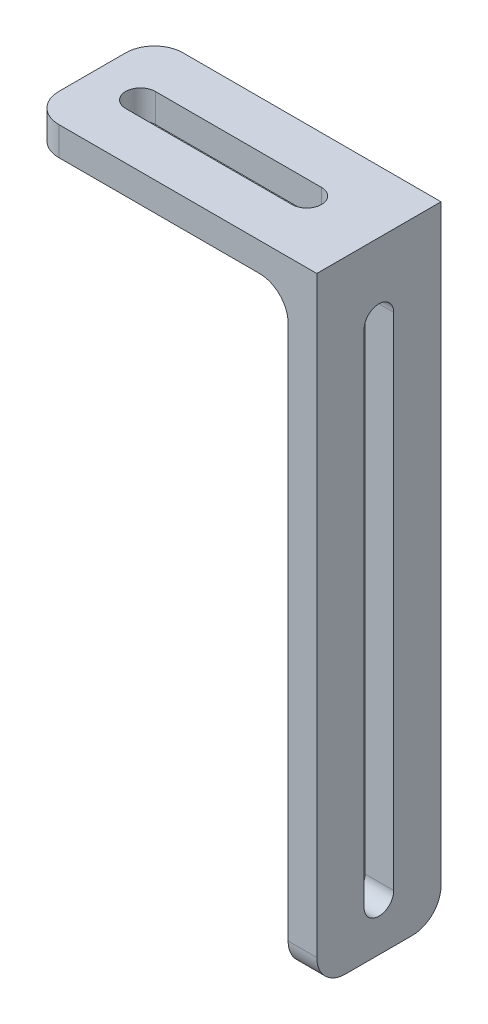
ISO-10303-21;
HEADER;
FILE_DESCRIPTION(('STEP AP214'),'2;1');
FILE_NAME('part.step','',(''),(''),'','','');
FILE_SCHEMA(('AUTOMOTIVE_DESIGN { 1 0 10303 214 1 1 1 1 }'));
ENDSEC;
DATA;
#1=APPLICATION_CONTEXT('core data for automotive mechanical design processes');
#2=APPLICATION_PROTOCOL_DEFINITION('international standard','automotive_design',2000,#1);
#3=PRODUCT_CONTEXT('',#1,'mechanical');
#4=PRODUCT('Part','Part','',(#3));
#5=PRODUCT_RELATED_PRODUCT_CATEGORY('part','',(#4));
#6=PRODUCT_DEFINITION_FORMATION('','',#4);
#7=PRODUCT_DEFINITION_CONTEXT('part definition',#1,'design');
#8=PRODUCT_DEFINITION('design','',#6,#7);
#9=PRODUCT_DEFINITION_SHAPE('','',#8);
#10=(LENGTH_UNIT() NAMED_UNIT(*) SI_UNIT(.MILLI.,.METRE.));
#11=(NAMED_UNIT(*) PLANE_ANGLE_UNIT() SI_UNIT($,.RADIAN.));
#12=(NAMED_UNIT(*) SI_UNIT($,.STERADIAN.) SOLID_ANGLE_UNIT());
#13=UNCERTAINTY_MEASURE_WITH_UNIT(LENGTH_MEASURE(1.E-05),#10,'distance_accuracy_value','');
#14=(GEOMETRIC_REPRESENTATION_CONTEXT(3) GLOBAL_UNCERTAINTY_ASSIGNED_CONTEXT((#13)) GLOBAL_UNIT_ASSIGNED_CONTEXT((#10,
#11,#12)) REPRESENTATION_CONTEXT('',''));
#15=CARTESIAN_POINT('',(0.,0.,0.));
#16=DIRECTION('',(0.,0.,1.));
#17=DIRECTION('',(1.,0.,0.));
#18=AXIS2_PLACEMENT_3D('',#15,#16,#17);
#19=CARTESIAN_POINT('',(0.,62.,13.));
#20=DIRECTION('',(1.,0.,0.));
#21=DIRECTION('',(0.,1.,0.));
#22=AXIS2_PLACEMENT_3D('',#19,#20,#21);
#23=PLANE('',#22);
#24=DIRECTION('',(0.,-1.,0.));
#25=VECTOR('',#24,1.);
#26=CARTESIAN_POINT('',(0.,62.,0.));
#27=LINE('',#26,#25);
#28=CARTESIAN_POINT('',(0.,59.,0.));
#29=VERTEX_POINT('',#28);
#30=CARTESIAN_POINT('',(0.,3.,0.));
#31=VERTEX_POINT('',#30);
#32=EDGE_CURVE('E243',#29,#31,#27,.T.);
#33=ORIENTED_EDGE('',*,*,#32,.T.);
#34=CARTESIAN_POINT('',(0.,3.,3.));
#35=DIRECTION('',(1.,0.,0.));
#36=DIRECTION('',(0.,1.,0.));
#37=AXIS2_PLACEMENT_3D('',#34,#35,#36);
#38=CIRCLE('',#37,3.);
#39=CARTESIAN_POINT('',(0.,0.,3.));
#40=VERTEX_POINT('',#39);
#41=EDGE_CURVE('E316',#31,#40,#38,.F.);
#42=ORIENTED_EDGE('',*,*,#41,.T.);
#43=DIRECTION('',(0.,0.,-1.));
#44=VECTOR('',#43,1.);
#45=CARTESIAN_POINT('',(0.,0.,13.));
#46=LINE('',#45,#44);
#47=CARTESIAN_POINT('',(0.,0.,10.));
#48=VERTEX_POINT('',#47);
#49=EDGE_CURVE('E273',#48,#40,#46,.T.);
#50=ORIENTED_EDGE('',*,*,#49,.F.);
#51=CARTESIAN_POINT('',(0.,3.,10.));
#52=DIRECTION('',(1.,0.,0.));
#53=DIRECTION('',(0.,1.,0.));
#54=AXIS2_PLACEMENT_3D('',#51,#52,#53);
#55=CIRCLE('',#54,3.);
#56=CARTESIAN_POINT('',(0.,3.,13.));
#57=VERTEX_POINT('',#56);
#58=EDGE_CURVE('E314',#48,#57,#55,.F.);
#59=ORIENTED_EDGE('',*,*,#58,.T.);
#60=DIRECTION('',(0.,-1.,0.));
#61=VECTOR('',#60,1.);
#62=CARTESIAN_POINT('',(0.,62.,13.));
#63=LINE('',#62,#61);
#64=CARTESIAN_POINT('',(0.,59.,13.));
#65=VERTEX_POINT('',#64);
#66=EDGE_CURVE('E244',#65,#57,#63,.T.);
#67=ORIENTED_EDGE('',*,*,#66,.F.);
#68=DIRECTION('',(0.,0.,-1.));
#69=VECTOR('',#68,1.);
#70=CARTESIAN_POINT('',(0.,59.,0.));
#71=LINE('',#70,#69);
#72=CARTESIAN_POINT('',(0.,59.,6.5));
#73=VERTEX_POINT('',#72);
#74=EDGE_CURVE('E288',#65,#73,#71,.T.);
#75=ORIENTED_EDGE('',*,*,#74,.T.);
#76=CARTESIAN_POINT('',(0.,57.45,6.5));
#77=DIRECTION('',(1.,0.,0.));
#78=DIRECTION('',(0.,1.,0.));
#79=AXIS2_PLACEMENT_3D('',#76,#77,#78);
#80=CIRCLE('',#79,1.55);
#81=CARTESIAN_POINT('',(0.,57.45,8.05));
#82=VERTEX_POINT('',#81);
#83=EDGE_CURVE('E239',#73,#82,#80,.T.);
#84=ORIENTED_EDGE('',*,*,#83,.T.);
#85=DIRECTION('',(0.,-1.,0.));
#86=VECTOR('',#85,1.);
#87=CARTESIAN_POINT('',(0.,62.,8.05));
#88=LINE('',#87,#86);
#89=CARTESIAN_POINT('',(0.,5.05000000000001,8.04999999999999));
#90=VERTEX_POINT('',#89);
#91=EDGE_CURVE('E224',#82,#90,#88,.T.);
#92=ORIENTED_EDGE('',*,*,#91,.T.);
#93=CARTESIAN_POINT('',(0.,5.05,6.49999999999999));
#94=DIRECTION('',(1.,0.,0.));
#95=DIRECTION('',(0.,1.,0.));
#96=AXIS2_PLACEMENT_3D('',#93,#94,#95);
#97=CIRCLE('',#96,1.55);
#98=CARTESIAN_POINT('',(0.,5.05,4.94999999999999));
#99=VERTEX_POINT('',#98);
#100=EDGE_CURVE('E233',#90,#99,#97,.T.);
#101=ORIENTED_EDGE('',*,*,#100,.T.);
#102=DIRECTION('',(0.,1.,0.));
#103=VECTOR('',#102,1.);
#104=CARTESIAN_POINT('',(0.,62.,4.95));
#105=LINE('',#104,#103);
#106=CARTESIAN_POINT('',(0.,57.45,4.95));
#107=VERTEX_POINT('',#106);
#108=EDGE_CURVE('E236',#99,#107,#105,.T.);
#109=ORIENTED_EDGE('',*,*,#108,.T.);
#110=EDGE_CURVE('E240',#107,#73,#80,.T.);
#111=ORIENTED_EDGE('',*,*,#110,.T.);
#112=DIRECTION('',(0.,0.,-1.));
#113=VECTOR('',#112,1.);
#114=CARTESIAN_POINT('',(0.,59.,0.));
#115=LINE('',#114,#113);
#116=EDGE_CURVE('E286',#73,#29,#115,.T.);
#117=ORIENTED_EDGE('',*,*,#116,.T.);
#118=EDGE_LOOP('',(#33,#42,#50,#59,#67,#75,#84,#92,#101,#109,#111,#117));
#119=FACE_BOUND('',#118,.T.);
#120=ADVANCED_FACE('F38',(#119),#23,.F.);
#121=CARTESIAN_POINT('',(0.,0.,13.));
#122=DIRECTION('',(0.,1.,0.));
#123=DIRECTION('',(0.,0.,1.));
#124=AXIS2_PLACEMENT_3D('',#121,#122,#123);
#125=PLANE('',#124);
#126=ORIENTED_EDGE('',*,*,#49,.T.);
#127=DIRECTION('',(1.,0.,0.));
#128=VECTOR('',#127,1.);
#129=CARTESIAN_POINT('',(0.,0.,3.));
#130=LINE('',#129,#128);
#131=CARTESIAN_POINT('',(3.,0.,3.));
#132=VERTEX_POINT('',#131);
#133=EDGE_CURVE('E303',#40,#132,#130,.T.);
#134=ORIENTED_EDGE('',*,*,#133,.T.);
#135=DIRECTION('',(0.,0.,-1.));
#136=VECTOR('',#135,1.);
#137=CARTESIAN_POINT('',(3.,0.,13.));
#138=LINE('',#137,#136);
#139=CARTESIAN_POINT('',(3.,0.,10.));
#140=VERTEX_POINT('',#139);
#141=EDGE_CURVE('E270',#140,#132,#138,.T.);
#142=ORIENTED_EDGE('',*,*,#141,.F.);
#143=DIRECTION('',(1.,0.,0.));
#144=VECTOR('',#143,1.);
#145=CARTESIAN_POINT('',(0.,0.,10.));
#146=LINE('',#145,#144);
#147=EDGE_CURVE('E301',#140,#48,#146,.F.);
#148=ORIENTED_EDGE('',*,*,#147,.T.);
#149=EDGE_LOOP('',(#126,#134,#142,#148));
#150=FACE_BOUND('',#149,.T.);
#151=ADVANCED_FACE('F360',(#150),#125,.F.);
#152=CARTESIAN_POINT('',(3.,0.,13.));
#153=DIRECTION('',(-1.,0.,0.));
#154=DIRECTION('',(0.,0.,1.));
#155=AXIS2_PLACEMENT_3D('',#152,#153,#154);
#156=PLANE('',#155);
#157=DIRECTION('',(0.,-1.,0.));
#158=VECTOR('',#157,1.);
#159=CARTESIAN_POINT('',(3.,57.45,8.05));
#160=LINE('',#159,#158);
#161=CARTESIAN_POINT('',(3.,57.45,8.05));
#162=VERTEX_POINT('',#161);
#163=CARTESIAN_POINT('',(3.,5.05,8.04999999999999));
#164=VERTEX_POINT('',#163);
#165=EDGE_CURVE('E212',#162,#164,#160,.T.);
#166=ORIENTED_EDGE('',*,*,#165,.F.);
#167=CARTESIAN_POINT('',(3.,57.45,6.5));
#168=DIRECTION('',(1.,0.,0.));
#169=DIRECTION('',(0.,0.,-1.));
#170=AXIS2_PLACEMENT_3D('',#167,#168,#169);
#171=CIRCLE('',#170,1.55);
#172=CARTESIAN_POINT('',(3.,57.45,4.95));
#173=VERTEX_POINT('',#172);
#174=EDGE_CURVE('E208',#173,#162,#171,.T.);
#175=ORIENTED_EDGE('',*,*,#174,.F.);
#176=DIRECTION('',(0.,1.,0.));
#177=VECTOR('',#176,1.);
#178=CARTESIAN_POINT('',(3.,57.45,4.95));
#179=LINE('',#178,#177);
#180=CARTESIAN_POINT('',(3.,5.05,4.94999999999999));
#181=VERTEX_POINT('',#180);
#182=EDGE_CURVE('E218',#181,#173,#179,.T.);
#183=ORIENTED_EDGE('',*,*,#182,.F.);
#184=CARTESIAN_POINT('',(3.,5.05,6.49999999999999));
#185=DIRECTION('',(1.,0.,0.));
#186=DIRECTION('',(0.,0.,-1.));
#187=AXIS2_PLACEMENT_3D('',#184,#185,#186);
#188=CIRCLE('',#187,1.55);
#189=EDGE_CURVE('E215',#164,#181,#188,.T.);
#190=ORIENTED_EDGE('',*,*,#189,.F.);
#191=EDGE_LOOP('',(#166,#175,#183,#190));
#192=FACE_BOUND('',#191,.T.);
#193=ORIENTED_EDGE('',*,*,#141,.T.);
#194=CARTESIAN_POINT('',(3.,3.,3.));
#195=DIRECTION('',(-1.,0.,0.));
#196=DIRECTION('',(0.,0.,1.));
#197=AXIS2_PLACEMENT_3D('',#194,#195,#196);
#198=CIRCLE('',#197,3.);
#199=CARTESIAN_POINT('',(3.,3.,0.));
#200=VERTEX_POINT('',#199);
#201=EDGE_CURVE('E308',#132,#200,#198,.F.);
#202=ORIENTED_EDGE('',*,*,#201,.T.);
#203=DIRECTION('',(0.,1.,0.));
#204=VECTOR('',#203,1.);
#205=CARTESIAN_POINT('',(3.,0.,0.));
#206=LINE('',#205,#204);
#207=CARTESIAN_POINT('',(3.,65.,0.));
#208=VERTEX_POINT('',#207);
#209=EDGE_CURVE('E258',#200,#208,#206,.T.);
#210=ORIENTED_EDGE('',*,*,#209,.T.);
#211=DIRECTION('',(0.,0.,-1.));
#212=VECTOR('',#211,1.);
#213=CARTESIAN_POINT('',(3.,65.,13.));
#214=LINE('',#213,#212);
#215=CARTESIAN_POINT('',(3.,65.,13.));
#216=VERTEX_POINT('',#215);
#217=EDGE_CURVE('E267',#216,#208,#214,.T.);
#218=ORIENTED_EDGE('',*,*,#217,.F.);
#219=DIRECTION('',(0.,1.,0.));
#220=VECTOR('',#219,1.);
#221=CARTESIAN_POINT('',(3.,0.,13.));
#222=LINE('',#221,#220);
#223=CARTESIAN_POINT('',(3.,3.,13.));
#224=VERTEX_POINT('',#223);
#225=EDGE_CURVE('E247',#224,#216,#222,.T.);
#226=ORIENTED_EDGE('',*,*,#225,.F.);
#227=CARTESIAN_POINT('',(3.,3.,10.));
#228=DIRECTION('',(-1.,0.,0.));
#229=DIRECTION('',(0.,0.,1.));
#230=AXIS2_PLACEMENT_3D('',#227,#228,#229);
#231=CIRCLE('',#230,3.);
#232=EDGE_CURVE('E306',#224,#140,#231,.F.);
#233=ORIENTED_EDGE('',*,*,#232,.T.);
#234=EDGE_LOOP('',(#193,#202,#210,#218,#226,#233));
#235=FACE_BOUND('',#234,.T.);
#236=ADVANCED_FACE('F366',(#192,#235),#156,.F.);
#237=CARTESIAN_POINT('',(3.,65.,13.));
#238=DIRECTION('',(0.,-1.,0.));
#239=DIRECTION('',(0.,0.,-1.));
#240=AXIS2_PLACEMENT_3D('',#237,#238,#239);
#241=PLANE('',#240);
#242=DIRECTION('',(1.,0.,0.));
#243=VECTOR('',#242,1.);
#244=CARTESIAN_POINT('',(-21.95,65.,8.05));
#245=LINE('',#244,#243);
#246=CARTESIAN_POINT('',(-21.95,65.,8.05));
#247=VERTEX_POINT('',#246);
#248=CARTESIAN_POINT('',(-4.55,65.,8.05));
#249=VERTEX_POINT('',#248);
#250=EDGE_CURVE('E192',#247,#249,#245,.T.);
#251=ORIENTED_EDGE('',*,*,#250,.F.);
#252=CARTESIAN_POINT('',(-21.95,65.,6.5));
#253=DIRECTION('',(0.,1.,0.));
#254=DIRECTION('',(0.,0.,1.));
#255=AXIS2_PLACEMENT_3D('',#252,#253,#254);
#256=CIRCLE('',#255,1.55);
#257=CARTESIAN_POINT('',(-21.95,65.,4.95));
#258=VERTEX_POINT('',#257);
#259=EDGE_CURVE('E197',#258,#247,#256,.T.);
#260=ORIENTED_EDGE('',*,*,#259,.F.);
#261=DIRECTION('',(1.,0.,0.));
#262=VECTOR('',#261,1.);
#263=CARTESIAN_POINT('',(-21.95,65.,4.95));
#264=LINE('',#263,#262);
#265=CARTESIAN_POINT('',(-4.55,65.,4.95));
#266=VERTEX_POINT('',#265);
#267=EDGE_CURVE('E201',#258,#266,#264,.T.);
#268=ORIENTED_EDGE('',*,*,#267,.T.);
#269=CARTESIAN_POINT('',(-4.55,65.,6.5));
#270=DIRECTION('',(0.,1.,0.));
#271=DIRECTION('',(0.,0.,1.));
#272=AXIS2_PLACEMENT_3D('',#269,#270,#271);
#273=CIRCLE('',#272,1.55);
#274=EDGE_CURVE('E180',#249,#266,#273,.T.);
#275=ORIENTED_EDGE('',*,*,#274,.F.);
#276=EDGE_LOOP('',(#251,#260,#268,#275));
#277=FACE_BOUND('',#276,.T.);
#278=DIRECTION('',(0.,0.,-1.));
#279=VECTOR('',#278,1.);
#280=CARTESIAN_POINT('',(-27.,65.,13.));
#281=LINE('',#280,#279);
#282=CARTESIAN_POINT('',(-27.,65.,10.));
#283=VERTEX_POINT('',#282);
#284=CARTESIAN_POINT('',(-27.,65.,3.));
#285=VERTEX_POINT('',#284);
#286=EDGE_CURVE('E265',#283,#285,#281,.T.);
#287=ORIENTED_EDGE('',*,*,#286,.F.);
#288=CARTESIAN_POINT('',(-24.,65.,10.));
#289=DIRECTION('',(0.,-1.,0.));
#290=DIRECTION('',(0.,0.,-1.));
#291=AXIS2_PLACEMENT_3D('',#288,#289,#290);
#292=CIRCLE('',#291,3.);
#293=CARTESIAN_POINT('',(-24.,65.,13.));
#294=VERTEX_POINT('',#293);
#295=EDGE_CURVE('E11',#283,#294,#292,.F.);
#296=ORIENTED_EDGE('',*,*,#295,.T.);
#297=DIRECTION('',(-1.,0.,0.));
#298=VECTOR('',#297,1.);
#299=CARTESIAN_POINT('',(3.,65.,13.));
#300=LINE('',#299,#298);
#301=EDGE_CURVE('E250',#216,#294,#300,.T.);
#302=ORIENTED_EDGE('',*,*,#301,.F.);
#303=ORIENTED_EDGE('',*,*,#217,.T.);
#304=DIRECTION('',(-1.,0.,0.));
#305=VECTOR('',#304,1.);
#306=CARTESIAN_POINT('',(3.,65.,0.));
#307=LINE('',#306,#305);
#308=CARTESIAN_POINT('',(-24.,65.,0.));
#309=VERTEX_POINT('',#308);
#310=EDGE_CURVE('E260',#208,#309,#307,.T.);
#311=ORIENTED_EDGE('',*,*,#310,.T.);
#312=CARTESIAN_POINT('',(-24.,65.,3.));
#313=DIRECTION('',(0.,-1.,0.));
#314=DIRECTION('',(0.,0.,-1.));
#315=AXIS2_PLACEMENT_3D('',#312,#313,#314);
#316=CIRCLE('',#315,3.);
#317=EDGE_CURVE('E46',#309,#285,#316,.F.);
#318=ORIENTED_EDGE('',*,*,#317,.T.);
#319=EDGE_LOOP('',(#287,#296,#302,#303,#311,#318));
#320=FACE_BOUND('',#319,.T.);
#321=ADVANCED_FACE('F199',(#277,#320),#241,.F.);
#322=CARTESIAN_POINT('',(-27.,65.,13.));
#323=DIRECTION('',(1.,0.,0.));
#324=DIRECTION('',(0.,1.,0.));
#325=AXIS2_PLACEMENT_3D('',#322,#323,#324);
#326=PLANE('',#325);
#327=DIRECTION('',(0.,0.,-1.));
#328=VECTOR('',#327,1.);
#329=CARTESIAN_POINT('',(-27.,62.,13.));
#330=LINE('',#329,#328);
#331=CARTESIAN_POINT('',(-27.,62.,10.));
#332=VERTEX_POINT('',#331);
#333=CARTESIAN_POINT('',(-27.,62.,3.));
#334=VERTEX_POINT('',#333);
#335=EDGE_CURVE('E255',#332,#334,#330,.T.);
#336=ORIENTED_EDGE('',*,*,#335,.F.);
#337=DIRECTION('',(0.,-1.,0.));
#338=VECTOR('',#337,1.);
#339=CARTESIAN_POINT('',(-27.,65.,10.));
#340=LINE('',#339,#338);
#341=EDGE_CURVE('E59',#332,#283,#340,.F.);
#342=ORIENTED_EDGE('',*,*,#341,.T.);
#343=ORIENTED_EDGE('',*,*,#286,.T.);
#344=DIRECTION('',(0.,-1.,0.));
#345=VECTOR('',#344,1.);
#346=CARTESIAN_POINT('',(-27.,65.,3.));
#347=LINE('',#346,#345);
#348=EDGE_CURVE('E328',#285,#334,#347,.T.);
#349=ORIENTED_EDGE('',*,*,#348,.T.);
#350=EDGE_LOOP('',(#336,#342,#343,#349));
#351=FACE_BOUND('',#350,.T.);
#352=ADVANCED_FACE('F332',(#351),#326,.F.);
#353=CARTESIAN_POINT('',(-27.,62.,13.));
#354=DIRECTION('',(0.,1.,0.));
#355=DIRECTION('',(0.,0.,1.));
#356=AXIS2_PLACEMENT_3D('',#353,#354,#355);
#357=PLANE('',#356);
#358=DIRECTION('',(1.,0.,0.));
#359=VECTOR('',#358,1.);
#360=CARTESIAN_POINT('',(-27.,62.,13.));
#361=LINE('',#360,#359);
#362=CARTESIAN_POINT('',(-24.,62.,13.));
#363=VERTEX_POINT('',#362);
#364=CARTESIAN_POINT('',(-3.,62.,13.));
#365=VERTEX_POINT('',#364);
#366=EDGE_CURVE('E253',#363,#365,#361,.T.);
#367=ORIENTED_EDGE('',*,*,#366,.F.);
#368=CARTESIAN_POINT('',(-24.,62.,10.));
#369=DIRECTION('',(0.,1.,0.));
#370=DIRECTION('',(0.,0.,1.));
#371=AXIS2_PLACEMENT_3D('',#368,#369,#370);
#372=CIRCLE('',#371,3.);
#373=EDGE_CURVE('E326',#363,#332,#372,.F.);
#374=ORIENTED_EDGE('',*,*,#373,.T.);
#375=ORIENTED_EDGE('',*,*,#335,.T.);
#376=CARTESIAN_POINT('',(-24.,62.,3.));
#377=DIRECTION('',(0.,1.,0.));
#378=DIRECTION('',(0.,0.,1.));
#379=AXIS2_PLACEMENT_3D('',#376,#377,#378);
#380=CIRCLE('',#379,3.);
#381=CARTESIAN_POINT('',(-24.,62.,0.));
#382=VERTEX_POINT('',#381);
#383=EDGE_CURVE('E324',#334,#382,#380,.F.);
#384=ORIENTED_EDGE('',*,*,#383,.T.);
#385=DIRECTION('',(1.,0.,0.));
#386=VECTOR('',#385,1.);
#387=CARTESIAN_POINT('',(-27.,62.,0.));
#388=LINE('',#387,#386);
#389=CARTESIAN_POINT('',(-3.,62.,0.));
#390=VERTEX_POINT('',#389);
#391=EDGE_CURVE('E248',#382,#390,#388,.T.);
#392=ORIENTED_EDGE('',*,*,#391,.T.);
#393=DIRECTION('',(0.,0.,-1.));
#394=VECTOR('',#393,1.);
#395=CARTESIAN_POINT('',(-3.,62.,13.));
#396=LINE('',#395,#394);
#397=CARTESIAN_POINT('',(-3.,62.,6.5));
#398=VERTEX_POINT('',#397);
#399=EDGE_CURVE('E294',#390,#398,#396,.F.);
#400=ORIENTED_EDGE('',*,*,#399,.T.);
#401=CARTESIAN_POINT('',(-4.55,62.,6.5));
#402=DIRECTION('',(0.,1.,0.));
#403=DIRECTION('',(0.,0.,1.));
#404=AXIS2_PLACEMENT_3D('',#401,#402,#403);
#405=CIRCLE('',#404,1.55);
#406=CARTESIAN_POINT('',(-4.55,62.,4.95));
#407=VERTEX_POINT('',#406);
#408=EDGE_CURVE('E278',#398,#407,#405,.T.);
#409=ORIENTED_EDGE('',*,*,#408,.T.);
#410=DIRECTION('',(1.,0.,0.));
#411=VECTOR('',#410,1.);
#412=CARTESIAN_POINT('',(-27.,62.,4.95));
#413=LINE('',#412,#411);
#414=CARTESIAN_POINT('',(-21.95,62.,4.95));
#415=VERTEX_POINT('',#414);
#416=EDGE_CURVE('E280',#415,#407,#413,.T.);
#417=ORIENTED_EDGE('',*,*,#416,.F.);
#418=CARTESIAN_POINT('',(-21.95,62.,6.5));
#419=DIRECTION('',(0.,1.,0.));
#420=DIRECTION('',(0.,0.,1.));
#421=AXIS2_PLACEMENT_3D('',#418,#419,#420);
#422=CIRCLE('',#421,1.55);
#423=CARTESIAN_POINT('',(-21.95,62.,8.05));
#424=VERTEX_POINT('',#423);
#425=EDGE_CURVE('E283',#415,#424,#422,.T.);
#426=ORIENTED_EDGE('',*,*,#425,.T.);
#427=DIRECTION('',(1.,0.,0.));
#428=VECTOR('',#427,1.);
#429=CARTESIAN_POINT('',(-27.,62.,8.05));
#430=LINE('',#429,#428);
#431=CARTESIAN_POINT('',(-4.55,62.,8.05));
#432=VERTEX_POINT('',#431);
#433=EDGE_CURVE('E276',#424,#432,#430,.T.);
#434=ORIENTED_EDGE('',*,*,#433,.T.);
#435=EDGE_CURVE('E184',#432,#398,#405,.T.);
#436=ORIENTED_EDGE('',*,*,#435,.T.);
#437=DIRECTION('',(0.,0.,-1.));
#438=VECTOR('',#437,1.);
#439=CARTESIAN_POINT('',(-3.,62.,13.));
#440=LINE('',#439,#438);
#441=EDGE_CURVE('E291',#398,#365,#440,.F.);
#442=ORIENTED_EDGE('',*,*,#441,.T.);
#443=EDGE_LOOP('',(#367,#374,#375,#384,#392,#400,#409,#417,#426,#434,#436,#442));
#444=FACE_BOUND('',#443,.T.);
#445=ADVANCED_FACE('F336',(#444),#357,.F.);
#446=CARTESIAN_POINT('',(0.,0.,13.));
#447=DIRECTION('',(0.,0.,1.));
#448=DIRECTION('',(1.,0.,0.));
#449=AXIS2_PLACEMENT_3D('',#446,#447,#448);
#450=PLANE('',#449);
#451=ORIENTED_EDGE('',*,*,#66,.T.);
#452=DIRECTION('',(1.,0.,0.));
#453=VECTOR('',#452,1.);
#454=CARTESIAN_POINT('',(3.,3.,13.));
#455=LINE('',#454,#453);
#456=EDGE_CURVE('E321',#57,#224,#455,.T.);
#457=ORIENTED_EDGE('',*,*,#456,.T.);
#458=ORIENTED_EDGE('',*,*,#225,.T.);
#459=ORIENTED_EDGE('',*,*,#301,.T.);
#460=DIRECTION('',(0.,-1.,0.));
#461=VECTOR('',#460,1.);
#462=CARTESIAN_POINT('',(-24.,62.,13.));
#463=LINE('',#462,#461);
#464=EDGE_CURVE('E318',#294,#363,#463,.T.);
#465=ORIENTED_EDGE('',*,*,#464,.T.);
#466=ORIENTED_EDGE('',*,*,#366,.T.);
#467=CARTESIAN_POINT('',(-3.,59.,13.));
#468=DIRECTION('',(0.,0.,1.));
#469=DIRECTION('',(1.,0.,0.));
#470=AXIS2_PLACEMENT_3D('',#467,#468,#469);
#471=CIRCLE('',#470,3.);
#472=EDGE_CURVE('E299',#365,#65,#471,.F.);
#473=ORIENTED_EDGE('',*,*,#472,.T.);
#474=EDGE_LOOP('',(#451,#457,#458,#459,#465,#466,#473));
#475=FACE_BOUND('',#474,.T.);
#476=ADVANCED_FACE('F343',(#475),#450,.T.);
#477=CARTESIAN_POINT('',(0.,0.,0.));
#478=DIRECTION('',(0.,0.,1.));
#479=DIRECTION('',(1.,0.,0.));
#480=AXIS2_PLACEMENT_3D('',#477,#478,#479);
#481=PLANE('',#480);
#482=ORIENTED_EDGE('',*,*,#209,.F.);
#483=DIRECTION('',(1.,0.,0.));
#484=VECTOR('',#483,1.);
#485=CARTESIAN_POINT('',(0.,3.,0.));
#486=LINE('',#485,#484);
#487=EDGE_CURVE('E312',#200,#31,#486,.F.);
#488=ORIENTED_EDGE('',*,*,#487,.T.);
#489=ORIENTED_EDGE('',*,*,#32,.F.);
#490=CARTESIAN_POINT('',(-3.,59.,0.));
#491=DIRECTION('',(0.,0.,1.));
#492=DIRECTION('',(1.,0.,0.));
#493=AXIS2_PLACEMENT_3D('',#490,#491,#492);
#494=CIRCLE('',#493,3.);
#495=EDGE_CURVE('E296',#29,#390,#494,.T.);
#496=ORIENTED_EDGE('',*,*,#495,.T.);
#497=ORIENTED_EDGE('',*,*,#391,.F.);
#498=DIRECTION('',(0.,-1.,0.));
#499=VECTOR('',#498,1.);
#500=CARTESIAN_POINT('',(-24.0000000000001,0.,0.));
#501=LINE('',#500,#499);
#502=EDGE_CURVE('E310',#382,#309,#501,.F.);
#503=ORIENTED_EDGE('',*,*,#502,.T.);
#504=ORIENTED_EDGE('',*,*,#310,.F.);
#505=EDGE_LOOP('',(#482,#488,#489,#496,#497,#503,#504));
#506=FACE_BOUND('',#505,.T.);
#507=ADVANCED_FACE('F351',(#506),#481,.F.);
#508=CARTESIAN_POINT('',(-27.,57.45,6.5));
#509=DIRECTION('',(1.,0.,0.));
#510=DIRECTION('',(0.,0.,-1.));
#511=AXIS2_PLACEMENT_3D('',#508,#509,#510);
#512=CYLINDRICAL_SURFACE('',#511,1.55);
#513=DIRECTION('',(1.,0.,0.));
#514=VECTOR('',#513,1.);
#515=CARTESIAN_POINT('',(-27.,57.45,4.95));
#516=LINE('',#515,#514);
#517=EDGE_CURVE('E222',#107,#173,#516,.T.);
#518=ORIENTED_EDGE('',*,*,#517,.T.);
#519=ORIENTED_EDGE('',*,*,#174,.T.);
#520=DIRECTION('',(1.,0.,0.));
#521=VECTOR('',#520,1.);
#522=CARTESIAN_POINT('',(-27.,57.45,8.05));
#523=LINE('',#522,#521);
#524=EDGE_CURVE('E221',#82,#162,#523,.T.);
#525=ORIENTED_EDGE('',*,*,#524,.F.);
#526=ORIENTED_EDGE('',*,*,#83,.F.);
#527=ORIENTED_EDGE('',*,*,#110,.F.);
#528=EDGE_LOOP('',(#518,#519,#525,#526,#527));
#529=FACE_BOUND('',#528,.T.);
#530=ADVANCED_FACE('F397',(#529),#512,.F.);
#531=CARTESIAN_POINT('',(-27.,57.45,4.95));
#532=DIRECTION('',(0.,0.,-1.));
#533=DIRECTION('',(0.,1.,0.));
#534=AXIS2_PLACEMENT_3D('',#531,#532,#533);
#535=PLANE('',#534);
#536=DIRECTION('',(1.,0.,0.));
#537=VECTOR('',#536,1.);
#538=CARTESIAN_POINT('',(-27.,5.05,4.94999999999999));
#539=LINE('',#538,#537);
#540=EDGE_CURVE('E225',#99,#181,#539,.T.);
#541=ORIENTED_EDGE('',*,*,#540,.T.);
#542=ORIENTED_EDGE('',*,*,#182,.T.);
#543=ORIENTED_EDGE('',*,*,#517,.F.);
#544=ORIENTED_EDGE('',*,*,#108,.F.);
#545=EDGE_LOOP('',(#541,#542,#543,#544));
#546=FACE_BOUND('',#545,.T.);
#547=ADVANCED_FACE('F403',(#546),#535,.F.);
#548=CARTESIAN_POINT('',(-27.,5.05,6.49999999999999));
#549=DIRECTION('',(1.,0.,0.));
#550=DIRECTION('',(0.,0.,-1.));
#551=AXIS2_PLACEMENT_3D('',#548,#549,#550);
#552=CYLINDRICAL_SURFACE('',#551,1.55);
#553=DIRECTION('',(1.,0.,0.));
#554=VECTOR('',#553,1.);
#555=CARTESIAN_POINT('',(-27.,5.05,8.04999999999999));
#556=LINE('',#555,#554);
#557=EDGE_CURVE('E227',#90,#164,#556,.T.);
#558=ORIENTED_EDGE('',*,*,#557,.T.);
#559=ORIENTED_EDGE('',*,*,#189,.T.);
#560=ORIENTED_EDGE('',*,*,#540,.F.);
#561=ORIENTED_EDGE('',*,*,#100,.F.);
#562=EDGE_LOOP('',(#558,#559,#560,#561));
#563=FACE_BOUND('',#562,.T.);
#564=ADVANCED_FACE('F405',(#563),#552,.F.);
#565=CARTESIAN_POINT('',(-27.,57.45,8.05));
#566=DIRECTION('',(0.,0.,1.));
#567=DIRECTION('',(0.,-1.,0.));
#568=AXIS2_PLACEMENT_3D('',#565,#566,#567);
#569=PLANE('',#568);
#570=ORIENTED_EDGE('',*,*,#524,.T.);
#571=ORIENTED_EDGE('',*,*,#165,.T.);
#572=ORIENTED_EDGE('',*,*,#557,.F.);
#573=ORIENTED_EDGE('',*,*,#91,.F.);
#574=EDGE_LOOP('',(#570,#571,#572,#573));
#575=FACE_BOUND('',#574,.T.);
#576=ADVANCED_FACE('F412',(#575),#569,.F.);
#577=CARTESIAN_POINT('',(-21.95,0.,6.5));
#578=DIRECTION('',(0.,1.,0.));
#579=DIRECTION('',(0.,0.,1.));
#580=AXIS2_PLACEMENT_3D('',#577,#578,#579);
#581=CYLINDRICAL_SURFACE('',#580,1.55);
#582=DIRECTION('',(0.,1.,0.));
#583=VECTOR('',#582,1.);
#584=CARTESIAN_POINT('',(-21.95,0.,4.95));
#585=LINE('',#584,#583);
#586=EDGE_CURVE('E206',#415,#258,#585,.T.);
#587=ORIENTED_EDGE('',*,*,#586,.T.);
#588=ORIENTED_EDGE('',*,*,#259,.T.);
#589=DIRECTION('',(0.,1.,0.));
#590=VECTOR('',#589,1.);
#591=CARTESIAN_POINT('',(-21.95,0.,8.05));
#592=LINE('',#591,#590);
#593=EDGE_CURVE('E188',#424,#247,#592,.T.);
#594=ORIENTED_EDGE('',*,*,#593,.F.);
#595=ORIENTED_EDGE('',*,*,#425,.F.);
#596=EDGE_LOOP('',(#587,#588,#594,#595));
#597=FACE_BOUND('',#596,.T.);
#598=ADVANCED_FACE('F414',(#597),#581,.F.);
#599=CARTESIAN_POINT('',(-21.95,0.,4.95));
#600=DIRECTION('',(0.,0.,1.));
#601=DIRECTION('',(1.,0.,0.));
#602=AXIS2_PLACEMENT_3D('',#599,#600,#601);
#603=PLANE('',#602);
#604=ORIENTED_EDGE('',*,*,#416,.T.);
#605=DIRECTION('',(0.,1.,0.));
#606=VECTOR('',#605,1.);
#607=CARTESIAN_POINT('',(-4.55,0.,4.95));
#608=LINE('',#607,#606);
#609=EDGE_CURVE('E187',#407,#266,#608,.T.);
#610=ORIENTED_EDGE('',*,*,#609,.T.);
#611=ORIENTED_EDGE('',*,*,#267,.F.);
#612=ORIENTED_EDGE('',*,*,#586,.F.);
#613=EDGE_LOOP('',(#604,#610,#611,#612));
#614=FACE_BOUND('',#613,.T.);
#615=ADVANCED_FACE('F420',(#614),#603,.T.);
#616=CARTESIAN_POINT('',(-4.55,0.,6.5));
#617=DIRECTION('',(0.,1.,0.));
#618=DIRECTION('',(0.,0.,1.));
#619=AXIS2_PLACEMENT_3D('',#616,#617,#618);
#620=CYLINDRICAL_SURFACE('',#619,1.55);
#621=DIRECTION('',(0.,1.,0.));
#622=VECTOR('',#621,1.);
#623=CARTESIAN_POINT('',(-4.55,0.,8.05));
#624=LINE('',#623,#622);
#625=EDGE_CURVE('E175',#432,#249,#624,.T.);
#626=ORIENTED_EDGE('',*,*,#625,.T.);
#627=ORIENTED_EDGE('',*,*,#274,.T.);
#628=ORIENTED_EDGE('',*,*,#609,.F.);
#629=ORIENTED_EDGE('',*,*,#408,.F.);
#630=ORIENTED_EDGE('',*,*,#435,.F.);
#631=EDGE_LOOP('',(#626,#627,#628,#629,#630));
#632=FACE_BOUND('',#631,.T.);
#633=ADVANCED_FACE('F177',(#632),#620,.F.);
#634=CARTESIAN_POINT('',(-21.95,0.,8.05));
#635=DIRECTION('',(0.,0.,1.));
#636=DIRECTION('',(1.,0.,0.));
#637=AXIS2_PLACEMENT_3D('',#634,#635,#636);
#638=PLANE('',#637);
#639=ORIENTED_EDGE('',*,*,#593,.T.);
#640=ORIENTED_EDGE('',*,*,#250,.T.);
#641=ORIENTED_EDGE('',*,*,#625,.F.);
#642=ORIENTED_EDGE('',*,*,#433,.F.);
#643=EDGE_LOOP('',(#639,#640,#641,#642));
#644=FACE_BOUND('',#643,.T.);
#645=ADVANCED_FACE('F193',(#644),#638,.F.);
#646=CARTESIAN_POINT('',(-3.,59.,13.));
#647=DIRECTION('',(0.,0.,1.));
#648=DIRECTION('',(1.,0.,0.));
#649=AXIS2_PLACEMENT_3D('',#646,#647,#648);
#650=CYLINDRICAL_SURFACE('',#649,3.);
#651=ORIENTED_EDGE('',*,*,#441,.F.);
#652=ORIENTED_EDGE('',*,*,#399,.F.);
#653=ORIENTED_EDGE('',*,*,#495,.F.);
#654=ORIENTED_EDGE('',*,*,#116,.F.);
#655=ORIENTED_EDGE('',*,*,#74,.F.);
#656=ORIENTED_EDGE('',*,*,#472,.F.);
#657=EDGE_LOOP('',(#651,#652,#653,#654,#655,#656));
#658=FACE_BOUND('',#657,.T.);
#659=ADVANCED_FACE('F371',(#658),#650,.F.);
#660=CARTESIAN_POINT('',(0.,3.,3.));
#661=DIRECTION('',(1.,0.,0.));
#662=DIRECTION('',(0.,0.,-1.));
#663=AXIS2_PLACEMENT_3D('',#660,#661,#662);
#664=CYLINDRICAL_SURFACE('',#663,3.);
#665=ORIENTED_EDGE('',*,*,#41,.F.);
#666=ORIENTED_EDGE('',*,*,#487,.F.);
#667=ORIENTED_EDGE('',*,*,#201,.F.);
#668=ORIENTED_EDGE('',*,*,#133,.F.);
#669=EDGE_LOOP('',(#665,#666,#667,#668));
#670=FACE_BOUND('',#669,.T.);
#671=ADVANCED_FACE('F374',(#670),#664,.T.);
#672=CARTESIAN_POINT('',(0.,3.,10.));
#673=DIRECTION('',(-1.,0.,0.));
#674=DIRECTION('',(0.,0.,1.));
#675=AXIS2_PLACEMENT_3D('',#672,#673,#674);
#676=CYLINDRICAL_SURFACE('',#675,3.);
#677=ORIENTED_EDGE('',*,*,#58,.F.);
#678=ORIENTED_EDGE('',*,*,#147,.F.);
#679=ORIENTED_EDGE('',*,*,#232,.F.);
#680=ORIENTED_EDGE('',*,*,#456,.F.);
#681=EDGE_LOOP('',(#677,#678,#679,#680));
#682=FACE_BOUND('',#681,.T.);
#683=ADVANCED_FACE('F358',(#682),#676,.T.);
#684=CARTESIAN_POINT('',(-24.0000000000001,0.,10.));
#685=DIRECTION('',(0.,1.,0.));
#686=DIRECTION('',(-1.,0.,0.));
#687=AXIS2_PLACEMENT_3D('',#684,#685,#686);
#688=CYLINDRICAL_SURFACE('',#687,3.);
#689=ORIENTED_EDGE('',*,*,#295,.F.);
#690=ORIENTED_EDGE('',*,*,#341,.F.);
#691=ORIENTED_EDGE('',*,*,#373,.F.);
#692=ORIENTED_EDGE('',*,*,#464,.F.);
#693=EDGE_LOOP('',(#689,#690,#691,#692));
#694=FACE_BOUND('',#693,.T.);
#695=ADVANCED_FACE('F341',(#694),#688,.T.);
#696=CARTESIAN_POINT('',(-24.,65.,3.));
#697=DIRECTION('',(0.,-1.,0.));
#698=DIRECTION('',(1.,0.,0.));
#699=AXIS2_PLACEMENT_3D('',#696,#697,#698);
#700=CYLINDRICAL_SURFACE('',#699,3.);
#701=ORIENTED_EDGE('',*,*,#317,.F.);
#702=ORIENTED_EDGE('',*,*,#502,.F.);
#703=ORIENTED_EDGE('',*,*,#383,.F.);
#704=ORIENTED_EDGE('',*,*,#348,.F.);
#705=EDGE_LOOP('',(#701,#702,#703,#704));
#706=FACE_BOUND('',#705,.T.);
#707=ADVANCED_FACE('F40',(#706),#700,.T.);
#708=CLOSED_SHELL('',(#120,#151,#236,#321,#352,#445,#476,#507,#530,#547,#564,#576,#598,#615,
#633,#645,#659,#671,#683,#695,#707));
#709=MANIFOLD_SOLID_BREP('B2',#708);
#710=ADVANCED_BREP_SHAPE_REPRESENTATION('',(#18,#709),#14);
#711=SHAPE_DEFINITION_REPRESENTATION(#9,#710);
ENDSEC;
END-ISO-10303-21;
